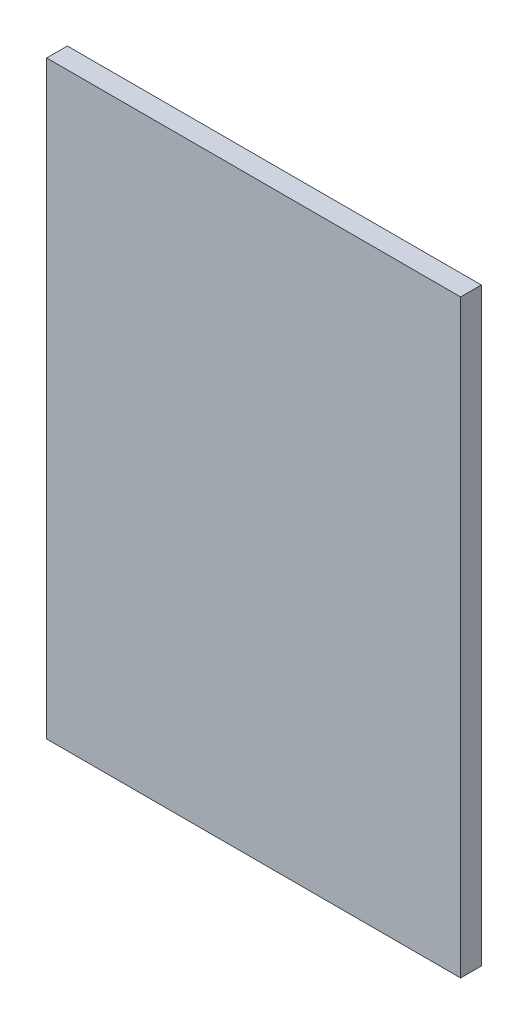
ISO-10303-21;
HEADER;
FILE_DESCRIPTION(('STEP AP214'),'2;1');
FILE_NAME('part.step','',(''),(''),'','','');
FILE_SCHEMA(('AUTOMOTIVE_DESIGN { 1 0 10303 214 1 1 1 1 }'));
ENDSEC;
DATA;
#1=APPLICATION_CONTEXT('core data for automotive mechanical design processes');
#2=APPLICATION_PROTOCOL_DEFINITION('international standard','automotive_design',2000,#1);
#3=PRODUCT_CONTEXT('',#1,'mechanical');
#4=PRODUCT('Part','Part','',(#3));
#5=PRODUCT_RELATED_PRODUCT_CATEGORY('part','',(#4));
#6=PRODUCT_DEFINITION_FORMATION('','',#4);
#7=PRODUCT_DEFINITION_CONTEXT('part definition',#1,'design');
#8=PRODUCT_DEFINITION('design','',#6,#7);
#9=PRODUCT_DEFINITION_SHAPE('','',#8);
#10=(LENGTH_UNIT() NAMED_UNIT(*) SI_UNIT(.MILLI.,.METRE.));
#11=(NAMED_UNIT(*) PLANE_ANGLE_UNIT() SI_UNIT($,.RADIAN.));
#12=(NAMED_UNIT(*) SI_UNIT($,.STERADIAN.) SOLID_ANGLE_UNIT());
#13=UNCERTAINTY_MEASURE_WITH_UNIT(LENGTH_MEASURE(1.E-05),#10,'distance_accuracy_value','');
#14=(GEOMETRIC_REPRESENTATION_CONTEXT(3) GLOBAL_UNCERTAINTY_ASSIGNED_CONTEXT((#13)) GLOBAL_UNIT_ASSIGNED_CONTEXT((#10,
#11,#12)) REPRESENTATION_CONTEXT('',''));
#15=CARTESIAN_POINT('',(0.,0.,0.));
#16=DIRECTION('',(0.,0.,1.));
#17=DIRECTION('',(1.,0.,0.));
#18=AXIS2_PLACEMENT_3D('',#15,#16,#17);
#19=CARTESIAN_POINT('',(127.,-180.975,6.35));
#20=DIRECTION('',(-1.,0.,0.));
#21=DIRECTION('',(0.,0.,1.));
#22=AXIS2_PLACEMENT_3D('',#19,#20,#21);
#23=PLANE('',#22);
#24=DIRECTION('',(0.,1.,0.));
#25=VECTOR('',#24,1.);
#26=CARTESIAN_POINT('',(127.,-180.975,-6.35));
#27=LINE('',#26,#25);
#28=CARTESIAN_POINT('',(127.,-180.975,-6.35));
#29=VERTEX_POINT('',#28);
#30=CARTESIAN_POINT('',(127.,180.975,-6.35));
#31=VERTEX_POINT('',#30);
#32=EDGE_CURVE('E96',#29,#31,#27,.T.);
#33=ORIENTED_EDGE('',*,*,#32,.T.);
#34=DIRECTION('',(0.,0.,-1.));
#35=VECTOR('',#34,1.);
#36=CARTESIAN_POINT('',(127.,180.975,6.35));
#37=LINE('',#36,#35);
#38=CARTESIAN_POINT('',(127.,180.975,6.35));
#39=VERTEX_POINT('',#38);
#40=EDGE_CURVE('E11',#39,#31,#37,.T.);
#41=ORIENTED_EDGE('',*,*,#40,.F.);
#42=DIRECTION('',(0.,1.,0.));
#43=VECTOR('',#42,1.);
#44=CARTESIAN_POINT('',(127.,-180.975,6.35));
#45=LINE('',#44,#43);
#46=CARTESIAN_POINT('',(127.,-180.975,6.35));
#47=VERTEX_POINT('',#46);
#48=EDGE_CURVE('E84',#47,#39,#45,.T.);
#49=ORIENTED_EDGE('',*,*,#48,.F.);
#50=DIRECTION('',(0.,0.,-1.));
#51=VECTOR('',#50,1.);
#52=CARTESIAN_POINT('',(127.,-180.975,6.35));
#53=LINE('',#52,#51);
#54=EDGE_CURVE('E92',#47,#29,#53,.T.);
#55=ORIENTED_EDGE('',*,*,#54,.T.);
#56=EDGE_LOOP('',(#33,#41,#49,#55));
#57=FACE_BOUND('',#56,.T.);
#58=ADVANCED_FACE('F33',(#57),#23,.F.);
#59=CARTESIAN_POINT('',(-127.,180.975,6.35));
#60=DIRECTION('',(0.,-1.,0.));
#61=DIRECTION('',(0.,0.,-1.));
#62=AXIS2_PLACEMENT_3D('',#59,#60,#61);
#63=PLANE('',#62);
#64=DIRECTION('',(-1.,0.,0.));
#65=VECTOR('',#64,1.);
#66=CARTESIAN_POINT('',(-127.,180.975,-6.35));
#67=LINE('',#66,#65);
#68=CARTESIAN_POINT('',(-127.,180.975,-6.35));
#69=VERTEX_POINT('',#68);
#70=EDGE_CURVE('E88',#31,#69,#67,.T.);
#71=ORIENTED_EDGE('',*,*,#70,.T.);
#72=DIRECTION('',(0.,0.,-1.));
#73=VECTOR('',#72,1.);
#74=CARTESIAN_POINT('',(-127.,180.975,6.35));
#75=LINE('',#74,#73);
#76=CARTESIAN_POINT('',(-127.,180.975,6.35));
#77=VERTEX_POINT('',#76);
#78=EDGE_CURVE('E41',#77,#69,#75,.T.);
#79=ORIENTED_EDGE('',*,*,#78,.F.);
#80=DIRECTION('',(-1.,0.,0.));
#81=VECTOR('',#80,1.);
#82=CARTESIAN_POINT('',(-127.,180.975,6.35));
#83=LINE('',#82,#81);
#84=EDGE_CURVE('E79',#39,#77,#83,.T.);
#85=ORIENTED_EDGE('',*,*,#84,.F.);
#86=ORIENTED_EDGE('',*,*,#40,.T.);
#87=EDGE_LOOP('',(#71,#79,#85,#86));
#88=FACE_BOUND('',#87,.T.);
#89=ADVANCED_FACE('F87',(#88),#63,.F.);
#90=CARTESIAN_POINT('',(-127.,-180.975,6.35));
#91=DIRECTION('',(1.,0.,0.));
#92=DIRECTION('',(0.,0.,-1.));
#93=AXIS2_PLACEMENT_3D('',#90,#91,#92);
#94=PLANE('',#93);
#95=DIRECTION('',(0.,-1.,0.));
#96=VECTOR('',#95,1.);
#97=CARTESIAN_POINT('',(-127.,-180.975,-6.35));
#98=LINE('',#97,#96);
#99=CARTESIAN_POINT('',(-127.,-180.975,-6.35));
#100=VERTEX_POINT('',#99);
#101=EDGE_CURVE('E66',#69,#100,#98,.T.);
#102=ORIENTED_EDGE('',*,*,#101,.T.);
#103=DIRECTION('',(0.,0.,-1.));
#104=VECTOR('',#103,1.);
#105=CARTESIAN_POINT('',(-127.,-180.975,6.35));
#106=LINE('',#105,#104);
#107=CARTESIAN_POINT('',(-127.,-180.975,6.35));
#108=VERTEX_POINT('',#107);
#109=EDGE_CURVE('E89',#108,#100,#106,.T.);
#110=ORIENTED_EDGE('',*,*,#109,.F.);
#111=DIRECTION('',(0.,-1.,0.));
#112=VECTOR('',#111,1.);
#113=CARTESIAN_POINT('',(-127.,-180.975,6.35));
#114=LINE('',#113,#112);
#115=EDGE_CURVE('E82',#77,#108,#114,.T.);
#116=ORIENTED_EDGE('',*,*,#115,.F.);
#117=ORIENTED_EDGE('',*,*,#78,.T.);
#118=EDGE_LOOP('',(#102,#110,#116,#117));
#119=FACE_BOUND('',#118,.T.);
#120=ADVANCED_FACE('F90',(#119),#94,.F.);
#121=CARTESIAN_POINT('',(-127.,-180.975,6.35));
#122=DIRECTION('',(0.,1.,0.));
#123=DIRECTION('',(0.,0.,1.));
#124=AXIS2_PLACEMENT_3D('',#121,#122,#123);
#125=PLANE('',#124);
#126=DIRECTION('',(1.,0.,0.));
#127=VECTOR('',#126,1.);
#128=CARTESIAN_POINT('',(-127.,-180.975,-6.35));
#129=LINE('',#128,#127);
#130=EDGE_CURVE('E72',#100,#29,#129,.T.);
#131=ORIENTED_EDGE('',*,*,#130,.T.);
#132=ORIENTED_EDGE('',*,*,#54,.F.);
#133=DIRECTION('',(1.,0.,0.));
#134=VECTOR('',#133,1.);
#135=CARTESIAN_POINT('',(-127.,-180.975,6.35));
#136=LINE('',#135,#134);
#137=EDGE_CURVE('E49',#108,#47,#136,.T.);
#138=ORIENTED_EDGE('',*,*,#137,.F.);
#139=ORIENTED_EDGE('',*,*,#109,.T.);
#140=EDGE_LOOP('',(#131,#132,#138,#139));
#141=FACE_BOUND('',#140,.T.);
#142=ADVANCED_FACE('F103',(#141),#125,.F.);
#143=CARTESIAN_POINT('',(0.,0.,6.35));
#144=DIRECTION('',(0.,0.,-1.));
#145=DIRECTION('',(-1.,0.,0.));
#146=AXIS2_PLACEMENT_3D('',#143,#144,#145);
#147=PLANE('',#146);
#148=ORIENTED_EDGE('',*,*,#48,.T.);
#149=ORIENTED_EDGE('',*,*,#84,.T.);
#150=ORIENTED_EDGE('',*,*,#115,.T.);
#151=ORIENTED_EDGE('',*,*,#137,.T.);
#152=EDGE_LOOP('',(#148,#149,#150,#151));
#153=FACE_BOUND('',#152,.T.);
#154=ADVANCED_FACE('F80',(#153),#147,.F.);
#155=CARTESIAN_POINT('',(0.,0.,-6.35));
#156=DIRECTION('',(0.,0.,-1.));
#157=DIRECTION('',(-1.,0.,0.));
#158=AXIS2_PLACEMENT_3D('',#155,#156,#157);
#159=PLANE('',#158);
#160=ORIENTED_EDGE('',*,*,#32,.F.);
#161=ORIENTED_EDGE('',*,*,#130,.F.);
#162=ORIENTED_EDGE('',*,*,#101,.F.);
#163=ORIENTED_EDGE('',*,*,#70,.F.);
#164=EDGE_LOOP('',(#160,#161,#162,#163));
#165=FACE_BOUND('',#164,.T.);
#166=ADVANCED_FACE('F106',(#165),#159,.T.);
#167=CLOSED_SHELL('',(#58,#89,#120,#142,#154,#166));
#168=MANIFOLD_SOLID_BREP('B2',#167);
#169=ADVANCED_BREP_SHAPE_REPRESENTATION('',(#18,#168),#14);
#170=SHAPE_DEFINITION_REPRESENTATION(#9,#169);
ENDSEC;
END-ISO-10303-21;
